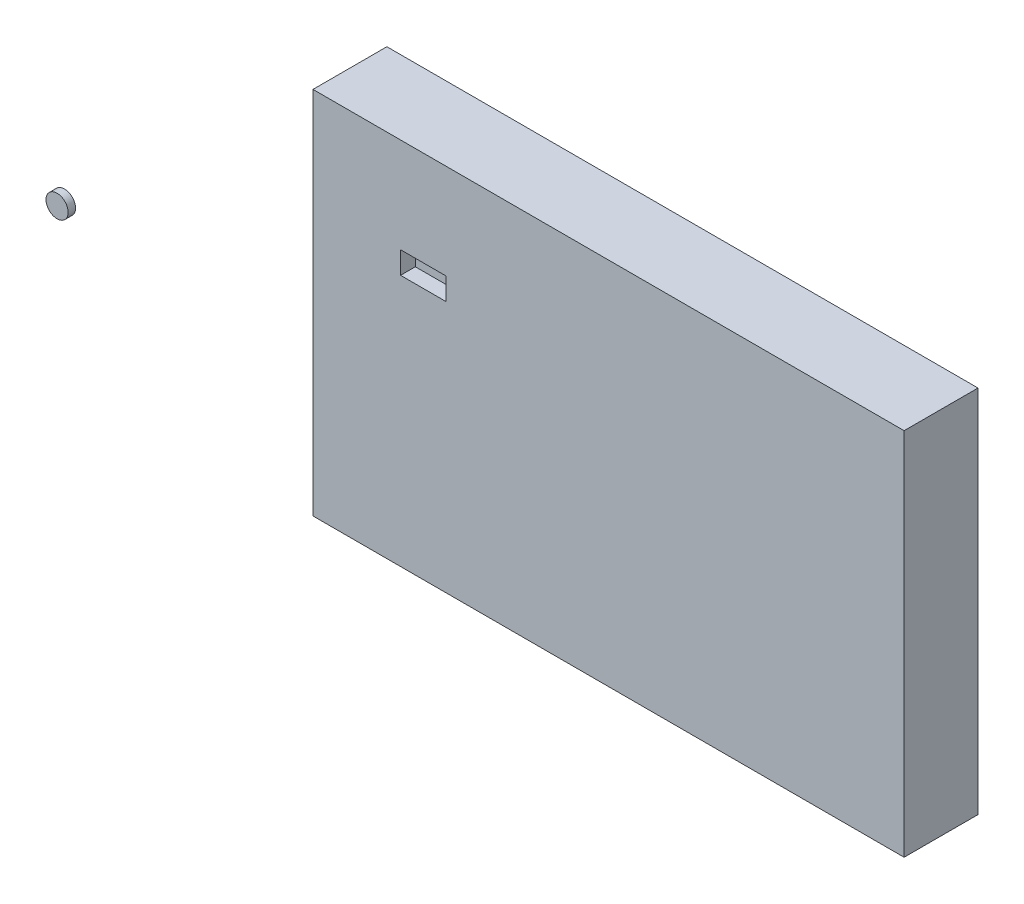
ISO-10303-21;
HEADER;
FILE_DESCRIPTION(('STEP AP214'),'2;1');
FILE_NAME('part.step','',(''),(''),'','','');
FILE_SCHEMA(('AUTOMOTIVE_DESIGN { 1 0 10303 214 1 1 1 1 }'));
ENDSEC;
DATA;
#1=APPLICATION_CONTEXT('core data for automotive mechanical design processes');
#2=APPLICATION_PROTOCOL_DEFINITION('international standard','automotive_design',2000,#1);
#3=PRODUCT_CONTEXT('',#1,'mechanical');
#4=PRODUCT('Part','Part','',(#3));
#5=PRODUCT_RELATED_PRODUCT_CATEGORY('part','',(#4));
#6=PRODUCT_DEFINITION_FORMATION('','',#4);
#7=PRODUCT_DEFINITION_CONTEXT('part definition',#1,'design');
#8=PRODUCT_DEFINITION('design','',#6,#7);
#9=PRODUCT_DEFINITION_SHAPE('','',#8);
#10=(LENGTH_UNIT() NAMED_UNIT(*) SI_UNIT(.MILLI.,.METRE.));
#11=(NAMED_UNIT(*) PLANE_ANGLE_UNIT() SI_UNIT($,.RADIAN.));
#12=(NAMED_UNIT(*) SI_UNIT($,.STERADIAN.) SOLID_ANGLE_UNIT());
#13=UNCERTAINTY_MEASURE_WITH_UNIT(LENGTH_MEASURE(1.E-05),#10,'distance_accuracy_value','');
#14=(GEOMETRIC_REPRESENTATION_CONTEXT(3) GLOBAL_UNCERTAINTY_ASSIGNED_CONTEXT((#13)) GLOBAL_UNIT_ASSIGNED_CONTEXT((#10,
#11,#12)) REPRESENTATION_CONTEXT('',''));
#15=CARTESIAN_POINT('',(0.,0.,0.));
#16=DIRECTION('',(0.,0.,1.));
#17=DIRECTION('',(1.,0.,0.));
#18=AXIS2_PLACEMENT_3D('',#15,#16,#17);
#19=CARTESIAN_POINT('',(-43.6335876793521,10.0140681583412,1.));
#20=DIRECTION('',(0.,0.,-1.));
#21=DIRECTION('',(-1.,0.,0.));
#22=AXIS2_PLACEMENT_3D('',#19,#20,#21);
#23=CYLINDRICAL_SURFACE('',#22,1.5);
#24=CARTESIAN_POINT('',(-43.6335876793521,10.0140681583412,1.));
#25=DIRECTION('',(0.,0.,1.));
#26=DIRECTION('',(1.,0.,0.));
#27=AXIS2_PLACEMENT_3D('',#24,#25,#26);
#28=CIRCLE('',#27,1.5);
#29=CARTESIAN_POINT('',(-42.1335876793521,10.0140681583412,1.));
#30=VERTEX_POINT('',#29);
#31=EDGE_CURVE('E11',#30,#30,#28,.T.);
#32=ORIENTED_EDGE('',*,*,#31,.F.);
#33=EDGE_LOOP('',(#32));
#34=FACE_BOUND('',#33,.T.);
#35=CARTESIAN_POINT('',(-43.6335876793521,10.0140681583412,0.));
#36=DIRECTION('',(0.,0.,1.));
#37=DIRECTION('',(1.,0.,0.));
#38=AXIS2_PLACEMENT_3D('',#35,#36,#37);
#39=CIRCLE('',#38,1.5);
#40=CARTESIAN_POINT('',(-42.1335876793521,10.0140681583412,0.));
#41=VERTEX_POINT('',#40);
#42=EDGE_CURVE('E43',#41,#41,#39,.T.);
#43=ORIENTED_EDGE('',*,*,#42,.T.);
#44=EDGE_LOOP('',(#43));
#45=FACE_BOUND('',#44,.T.);
#46=ADVANCED_FACE('F40',(#34,#45),#23,.T.);
#47=CARTESIAN_POINT('',(-43.6335876793521,10.0140681583412,1.));
#48=DIRECTION('',(0.,0.,1.));
#49=DIRECTION('',(1.,0.,0.));
#50=AXIS2_PLACEMENT_3D('',#47,#48,#49);
#51=PLANE('',#50);
#52=ORIENTED_EDGE('',*,*,#31,.T.);
#53=EDGE_LOOP('',(#52));
#54=FACE_BOUND('',#53,.T.);
#55=ADVANCED_FACE('F55',(#54),#51,.T.);
#56=CARTESIAN_POINT('',(-43.6335876793521,10.0140681583412,0.));
#57=DIRECTION('',(0.,0.,1.));
#58=DIRECTION('',(1.,0.,0.));
#59=AXIS2_PLACEMENT_3D('',#56,#57,#58);
#60=PLANE('',#59);
#61=ORIENTED_EDGE('',*,*,#42,.F.);
#62=EDGE_LOOP('',(#61));
#63=FACE_BOUND('',#62,.T.);
#64=ADVANCED_FACE('F53',(#63),#60,.F.);
#65=CLOSED_SHELL('',(#46,#55,#64));
#66=MANIFOLD_SOLID_BREP('B2',#65);
#67=CARTESIAN_POINT('',(0.,0.,10.));
#68=DIRECTION('',(1.,0.,0.));
#69=DIRECTION('',(0.,0.,-1.));
#70=AXIS2_PLACEMENT_3D('',#67,#68,#69);
#71=PLANE('',#70);
#72=DIRECTION('',(0.,-1.,0.));
#73=VECTOR('',#72,1.);
#74=CARTESIAN_POINT('',(0.,0.,0.));
#75=LINE('',#74,#73);
#76=CARTESIAN_POINT('',(0.,50.,0.));
#77=VERTEX_POINT('',#76);
#78=CARTESIAN_POINT('',(0.,0.,0.));
#79=VERTEX_POINT('',#78);
#80=EDGE_CURVE('E188',#77,#79,#75,.T.);
#81=ORIENTED_EDGE('',*,*,#80,.T.);
#82=DIRECTION('',(0.,0.,-1.));
#83=VECTOR('',#82,1.);
#84=CARTESIAN_POINT('',(0.,0.,10.));
#85=LINE('',#84,#83);
#86=CARTESIAN_POINT('',(0.,0.,10.));
#87=VERTEX_POINT('',#86);
#88=EDGE_CURVE('E38',#87,#79,#85,.T.);
#89=ORIENTED_EDGE('',*,*,#88,.F.);
#90=DIRECTION('',(0.,-1.,0.));
#91=VECTOR('',#90,1.);
#92=CARTESIAN_POINT('',(0.,0.,10.));
#93=LINE('',#92,#91);
#94=CARTESIAN_POINT('',(0.,50.,10.));
#95=VERTEX_POINT('',#94);
#96=EDGE_CURVE('E192',#95,#87,#93,.T.);
#97=ORIENTED_EDGE('',*,*,#96,.F.);
#98=DIRECTION('',(0.,0.,-1.));
#99=VECTOR('',#98,1.);
#100=CARTESIAN_POINT('',(0.,50.,10.));
#101=LINE('',#100,#99);
#102=EDGE_CURVE('E198',#95,#77,#101,.T.);
#103=ORIENTED_EDGE('',*,*,#102,.T.);
#104=EDGE_LOOP('',(#81,#89,#97,#103));
#105=FACE_BOUND('',#104,.T.);
#106=ADVANCED_FACE('F80',(#105),#71,.F.);
#107=CARTESIAN_POINT('',(0.,0.,10.));
#108=DIRECTION('',(0.,1.,0.));
#109=DIRECTION('',(0.,0.,1.));
#110=AXIS2_PLACEMENT_3D('',#107,#108,#109);
#111=PLANE('',#110);
#112=DIRECTION('',(1.,0.,0.));
#113=VECTOR('',#112,1.);
#114=CARTESIAN_POINT('',(0.,0.,0.));
#115=LINE('',#114,#113);
#116=CARTESIAN_POINT('',(80.,0.,0.));
#117=VERTEX_POINT('',#116);
#118=EDGE_CURVE('E201',#79,#117,#115,.T.);
#119=ORIENTED_EDGE('',*,*,#118,.T.);
#120=DIRECTION('',(0.,0.,-1.));
#121=VECTOR('',#120,1.);
#122=CARTESIAN_POINT('',(80.,0.,10.));
#123=LINE('',#122,#121);
#124=CARTESIAN_POINT('',(80.,0.,10.));
#125=VERTEX_POINT('',#124);
#126=EDGE_CURVE('E87',#125,#117,#123,.T.);
#127=ORIENTED_EDGE('',*,*,#126,.F.);
#128=DIRECTION('',(1.,0.,0.));
#129=VECTOR('',#128,1.);
#130=CARTESIAN_POINT('',(0.,0.,10.));
#131=LINE('',#130,#129);
#132=EDGE_CURVE('E131',#87,#125,#131,.T.);
#133=ORIENTED_EDGE('',*,*,#132,.F.);
#134=ORIENTED_EDGE('',*,*,#88,.T.);
#135=EDGE_LOOP('',(#119,#127,#133,#134));
#136=FACE_BOUND('',#135,.T.);
#137=ADVANCED_FACE('F231',(#136),#111,.F.);
#138=CARTESIAN_POINT('',(80.,0.,10.));
#139=DIRECTION('',(-1.,0.,0.));
#140=DIRECTION('',(0.,0.,1.));
#141=AXIS2_PLACEMENT_3D('',#138,#139,#140);
#142=PLANE('',#141);
#143=DIRECTION('',(0.,1.,0.));
#144=VECTOR('',#143,1.);
#145=CARTESIAN_POINT('',(80.,0.,0.));
#146=LINE('',#145,#144);
#147=CARTESIAN_POINT('',(80.,50.,0.));
#148=VERTEX_POINT('',#147);
#149=EDGE_CURVE('E203',#117,#148,#146,.T.);
#150=ORIENTED_EDGE('',*,*,#149,.T.);
#151=DIRECTION('',(0.,0.,-1.));
#152=VECTOR('',#151,1.);
#153=CARTESIAN_POINT('',(80.,50.,10.));
#154=LINE('',#153,#152);
#155=CARTESIAN_POINT('',(80.,50.,10.));
#156=VERTEX_POINT('',#155);
#157=EDGE_CURVE('E207',#156,#148,#154,.T.);
#158=ORIENTED_EDGE('',*,*,#157,.F.);
#159=DIRECTION('',(0.,1.,0.));
#160=VECTOR('',#159,1.);
#161=CARTESIAN_POINT('',(80.,0.,10.));
#162=LINE('',#161,#160);
#163=EDGE_CURVE('E195',#125,#156,#162,.T.);
#164=ORIENTED_EDGE('',*,*,#163,.F.);
#165=ORIENTED_EDGE('',*,*,#126,.T.);
#166=EDGE_LOOP('',(#150,#158,#164,#165));
#167=FACE_BOUND('',#166,.T.);
#168=ADVANCED_FACE('F212',(#167),#142,.F.);
#169=CARTESIAN_POINT('',(0.,50.,10.));
#170=DIRECTION('',(0.,-1.,0.));
#171=DIRECTION('',(0.,0.,-1.));
#172=AXIS2_PLACEMENT_3D('',#169,#170,#171);
#173=PLANE('',#172);
#174=DIRECTION('',(-1.,0.,0.));
#175=VECTOR('',#174,1.);
#176=CARTESIAN_POINT('',(0.,50.,0.));
#177=LINE('',#176,#175);
#178=EDGE_CURVE('E124',#148,#77,#177,.T.);
#179=ORIENTED_EDGE('',*,*,#178,.T.);
#180=ORIENTED_EDGE('',*,*,#102,.F.);
#181=DIRECTION('',(-1.,0.,0.));
#182=VECTOR('',#181,1.);
#183=CARTESIAN_POINT('',(0.,50.,10.));
#184=LINE('',#183,#182);
#185=EDGE_CURVE('E103',#156,#95,#184,.T.);
#186=ORIENTED_EDGE('',*,*,#185,.F.);
#187=ORIENTED_EDGE('',*,*,#157,.T.);
#188=EDGE_LOOP('',(#179,#180,#186,#187));
#189=FACE_BOUND('',#188,.T.);
#190=ADVANCED_FACE('F220',(#189),#173,.F.);
#191=CARTESIAN_POINT('',(0.,50.,10.));
#192=DIRECTION('',(0.,0.,-1.));
#193=DIRECTION('',(-1.,0.,0.));
#194=AXIS2_PLACEMENT_3D('',#191,#192,#193);
#195=PLANE('',#194);
#196=DIRECTION('',(1.,0.,0.));
#197=VECTOR('',#196,1.);
#198=CARTESIAN_POINT('',(11.851754982473,34.1340366019267,10.));
#199=LINE('',#198,#197);
#200=CARTESIAN_POINT('',(11.851754982473,34.1340366019267,10.));
#201=VERTEX_POINT('',#200);
#202=CARTESIAN_POINT('',(18.0091075021664,34.1340366019267,10.));
#203=VERTEX_POINT('',#202);
#204=EDGE_CURVE('E182',#201,#203,#199,.T.);
#205=ORIENTED_EDGE('',*,*,#204,.F.);
#206=DIRECTION('',(0.,-1.,0.));
#207=VECTOR('',#206,1.);
#208=CARTESIAN_POINT('',(11.851754982473,37.1340366019267,10.));
#209=LINE('',#208,#207);
#210=CARTESIAN_POINT('',(11.851754982473,37.1340366019267,10.));
#211=VERTEX_POINT('',#210);
#212=EDGE_CURVE('E94',#211,#201,#209,.T.);
#213=ORIENTED_EDGE('',*,*,#212,.F.);
#214=DIRECTION('',(-1.,0.,0.));
#215=VECTOR('',#214,1.);
#216=CARTESIAN_POINT('',(11.851754982473,37.1340366019267,10.));
#217=LINE('',#216,#215);
#218=CARTESIAN_POINT('',(18.0091075021664,37.1340366019267,10.));
#219=VERTEX_POINT('',#218);
#220=EDGE_CURVE('E173',#219,#211,#217,.T.);
#221=ORIENTED_EDGE('',*,*,#220,.F.);
#222=DIRECTION('',(0.,1.,0.));
#223=VECTOR('',#222,1.);
#224=CARTESIAN_POINT('',(18.0091075021664,37.1340366019267,10.));
#225=LINE('',#224,#223);
#226=EDGE_CURVE('E176',#203,#219,#225,.T.);
#227=ORIENTED_EDGE('',*,*,#226,.F.);
#228=EDGE_LOOP('',(#205,#213,#221,#227));
#229=FACE_BOUND('',#228,.T.);
#230=ORIENTED_EDGE('',*,*,#96,.T.);
#231=ORIENTED_EDGE('',*,*,#132,.T.);
#232=ORIENTED_EDGE('',*,*,#163,.T.);
#233=ORIENTED_EDGE('',*,*,#185,.T.);
#234=EDGE_LOOP('',(#230,#231,#232,#233));
#235=FACE_BOUND('',#234,.T.);
#236=ADVANCED_FACE('F222',(#229,#235),#195,.F.);
#237=CARTESIAN_POINT('',(0.,50.,0.));
#238=DIRECTION('',(0.,0.,-1.));
#239=DIRECTION('',(-1.,0.,0.));
#240=AXIS2_PLACEMENT_3D('',#237,#238,#239);
#241=PLANE('',#240);
#242=ORIENTED_EDGE('',*,*,#80,.F.);
#243=ORIENTED_EDGE('',*,*,#178,.F.);
#244=ORIENTED_EDGE('',*,*,#149,.F.);
#245=ORIENTED_EDGE('',*,*,#118,.F.);
#246=EDGE_LOOP('',(#242,#243,#244,#245));
#247=FACE_BOUND('',#246,.T.);
#248=ADVANCED_FACE('F216',(#247),#241,.T.);
#249=CARTESIAN_POINT('',(11.851754982473,37.1340366019267,8.));
#250=DIRECTION('',(-1.,0.,0.));
#251=DIRECTION('',(0.,0.,1.));
#252=AXIS2_PLACEMENT_3D('',#249,#250,#251);
#253=PLANE('',#252);
#254=ORIENTED_EDGE('',*,*,#212,.T.);
#255=DIRECTION('',(0.,0.,1.));
#256=VECTOR('',#255,1.);
#257=CARTESIAN_POINT('',(11.851754982473,34.1340366019267,8.));
#258=LINE('',#257,#256);
#259=CARTESIAN_POINT('',(11.851754982473,34.1340366019267,8.));
#260=VERTEX_POINT('',#259);
#261=EDGE_CURVE('E151',#260,#201,#258,.T.);
#262=ORIENTED_EDGE('',*,*,#261,.F.);
#263=DIRECTION('',(0.,-1.,0.));
#264=VECTOR('',#263,1.);
#265=CARTESIAN_POINT('',(11.851754982473,37.1340366019267,8.));
#266=LINE('',#265,#264);
#267=CARTESIAN_POINT('',(11.851754982473,37.1340366019267,8.));
#268=VERTEX_POINT('',#267);
#269=EDGE_CURVE('E155',#268,#260,#266,.T.);
#270=ORIENTED_EDGE('',*,*,#269,.F.);
#271=DIRECTION('',(0.,0.,1.));
#272=VECTOR('',#271,1.);
#273=CARTESIAN_POINT('',(11.851754982473,37.1340366019267,8.));
#274=LINE('',#273,#272);
#275=EDGE_CURVE('E186',#268,#211,#274,.T.);
#276=ORIENTED_EDGE('',*,*,#275,.T.);
#277=EDGE_LOOP('',(#254,#262,#270,#276));
#278=FACE_BOUND('',#277,.T.);
#279=ADVANCED_FACE('F153',(#278),#253,.F.);
#280=CARTESIAN_POINT('',(11.851754982473,37.1340366019267,8.));
#281=DIRECTION('',(0.,1.,0.));
#282=DIRECTION('',(0.,0.,1.));
#283=AXIS2_PLACEMENT_3D('',#280,#281,#282);
#284=PLANE('',#283);
#285=ORIENTED_EDGE('',*,*,#220,.T.);
#286=ORIENTED_EDGE('',*,*,#275,.F.);
#287=DIRECTION('',(-1.,0.,0.));
#288=VECTOR('',#287,1.);
#289=CARTESIAN_POINT('',(11.851754982473,37.1340366019267,8.));
#290=LINE('',#289,#288);
#291=CARTESIAN_POINT('',(18.0091075021664,37.1340366019267,8.));
#292=VERTEX_POINT('',#291);
#293=EDGE_CURVE('E161',#292,#268,#290,.T.);
#294=ORIENTED_EDGE('',*,*,#293,.F.);
#295=DIRECTION('',(0.,0.,1.));
#296=VECTOR('',#295,1.);
#297=CARTESIAN_POINT('',(18.0091075021664,37.1340366019267,8.));
#298=LINE('',#297,#296);
#299=EDGE_CURVE('E189',#292,#219,#298,.T.);
#300=ORIENTED_EDGE('',*,*,#299,.T.);
#301=EDGE_LOOP('',(#285,#286,#294,#300));
#302=FACE_BOUND('',#301,.T.);
#303=ADVANCED_FACE('F274',(#302),#284,.F.);
#304=CARTESIAN_POINT('',(18.0091075021664,37.1340366019267,8.));
#305=DIRECTION('',(1.,0.,0.));
#306=DIRECTION('',(0.,0.,-1.));
#307=AXIS2_PLACEMENT_3D('',#304,#305,#306);
#308=PLANE('',#307);
#309=ORIENTED_EDGE('',*,*,#226,.T.);
#310=ORIENTED_EDGE('',*,*,#299,.F.);
#311=DIRECTION('',(0.,1.,0.));
#312=VECTOR('',#311,1.);
#313=CARTESIAN_POINT('',(18.0091075021664,37.1340366019267,8.));
#314=LINE('',#313,#312);
#315=CARTESIAN_POINT('',(18.0091075021664,34.1340366019267,8.));
#316=VERTEX_POINT('',#315);
#317=EDGE_CURVE('E169',#316,#292,#314,.T.);
#318=ORIENTED_EDGE('',*,*,#317,.F.);
#319=DIRECTION('',(0.,0.,1.));
#320=VECTOR('',#319,1.);
#321=CARTESIAN_POINT('',(18.0091075021664,34.1340366019267,8.));
#322=LINE('',#321,#320);
#323=EDGE_CURVE('E160',#316,#203,#322,.T.);
#324=ORIENTED_EDGE('',*,*,#323,.T.);
#325=EDGE_LOOP('',(#309,#310,#318,#324));
#326=FACE_BOUND('',#325,.T.);
#327=ADVANCED_FACE('F282',(#326),#308,.F.);
#328=CARTESIAN_POINT('',(11.851754982473,34.1340366019267,8.));
#329=DIRECTION('',(0.,-1.,0.));
#330=DIRECTION('',(0.,0.,-1.));
#331=AXIS2_PLACEMENT_3D('',#328,#329,#330);
#332=PLANE('',#331);
#333=ORIENTED_EDGE('',*,*,#204,.T.);
#334=ORIENTED_EDGE('',*,*,#323,.F.);
#335=DIRECTION('',(1.,0.,0.));
#336=VECTOR('',#335,1.);
#337=CARTESIAN_POINT('',(11.851754982473,34.1340366019267,8.));
#338=LINE('',#337,#336);
#339=EDGE_CURVE('E164',#260,#316,#338,.T.);
#340=ORIENTED_EDGE('',*,*,#339,.F.);
#341=ORIENTED_EDGE('',*,*,#261,.T.);
#342=EDGE_LOOP('',(#333,#334,#340,#341));
#343=FACE_BOUND('',#342,.T.);
#344=ADVANCED_FACE('F165',(#343),#332,.F.);
#345=CARTESIAN_POINT('',(11.851754982473,34.1340366019267,8.));
#346=DIRECTION('',(0.,0.,1.));
#347=DIRECTION('',(1.,0.,0.));
#348=AXIS2_PLACEMENT_3D('',#345,#346,#347);
#349=PLANE('',#348);
#350=ORIENTED_EDGE('',*,*,#269,.T.);
#351=ORIENTED_EDGE('',*,*,#339,.T.);
#352=ORIENTED_EDGE('',*,*,#317,.T.);
#353=ORIENTED_EDGE('',*,*,#293,.T.);
#354=EDGE_LOOP('',(#350,#351,#352,#353));
#355=FACE_BOUND('',#354,.T.);
#356=ADVANCED_FACE('F171',(#355),#349,.T.);
#357=CLOSED_SHELL('',(#106,#137,#168,#190,#236,#248,#279,#303,#327,#344,#356));
#358=MANIFOLD_SOLID_BREP('B6',#357);
#359=ADVANCED_BREP_SHAPE_REPRESENTATION('',(#18,#66,#358),#14);
#360=SHAPE_DEFINITION_REPRESENTATION(#9,#359);
ENDSEC;
END-ISO-10303-21;
